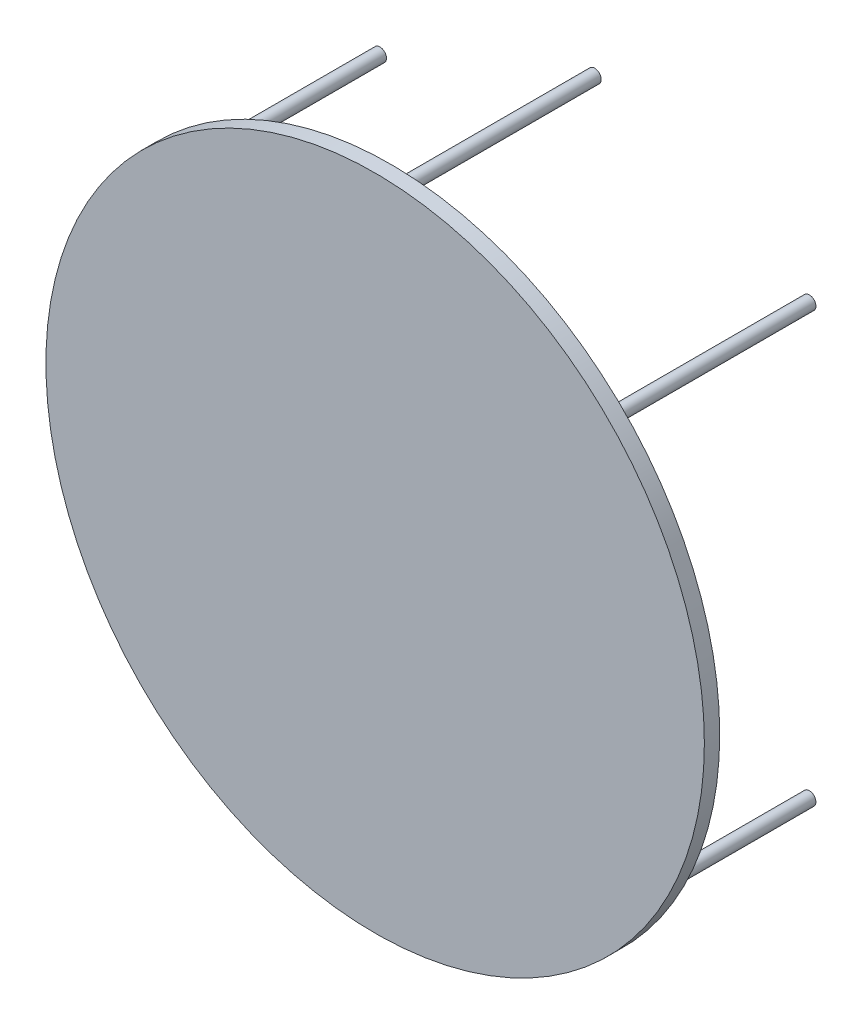
ISO-10303-21;
HEADER;
FILE_DESCRIPTION(('STEP AP214'),'2;1');
FILE_NAME('part.step','',(''),(''),'','','');
FILE_SCHEMA(('AUTOMOTIVE_DESIGN { 1 0 10303 214 1 1 1 1 }'));
ENDSEC;
DATA;
#1=APPLICATION_CONTEXT('core data for automotive mechanical design processes');
#2=APPLICATION_PROTOCOL_DEFINITION('international standard','automotive_design',2000,#1);
#3=PRODUCT_CONTEXT('',#1,'mechanical');
#4=PRODUCT('Part','Part','',(#3));
#5=PRODUCT_RELATED_PRODUCT_CATEGORY('part','',(#4));
#6=PRODUCT_DEFINITION_FORMATION('','',#4);
#7=PRODUCT_DEFINITION_CONTEXT('part definition',#1,'design');
#8=PRODUCT_DEFINITION('design','',#6,#7);
#9=PRODUCT_DEFINITION_SHAPE('','',#8);
#10=(LENGTH_UNIT() NAMED_UNIT(*) SI_UNIT(.MILLI.,.METRE.));
#11=(NAMED_UNIT(*) PLANE_ANGLE_UNIT() SI_UNIT($,.RADIAN.));
#12=(NAMED_UNIT(*) SI_UNIT($,.STERADIAN.) SOLID_ANGLE_UNIT());
#13=UNCERTAINTY_MEASURE_WITH_UNIT(LENGTH_MEASURE(1.E-05),#10,'distance_accuracy_value','');
#14=(GEOMETRIC_REPRESENTATION_CONTEXT(3) GLOBAL_UNCERTAINTY_ASSIGNED_CONTEXT((#13)) GLOBAL_UNIT_ASSIGNED_CONTEXT((#10,
#11,#12)) REPRESENTATION_CONTEXT('',''));
#15=CARTESIAN_POINT('',(0.,0.,0.));
#16=DIRECTION('',(0.,0.,1.));
#17=DIRECTION('',(1.,0.,0.));
#18=AXIS2_PLACEMENT_3D('',#15,#16,#17);
#19=CARTESIAN_POINT('',(0.,0.,5.334));
#20=DIRECTION('',(0.,0.,-1.));
#21=DIRECTION('',(-1.,0.,0.));
#22=AXIS2_PLACEMENT_3D('',#19,#20,#21);
#23=CYLINDRICAL_SURFACE('',#22,114.3);
#24=CARTESIAN_POINT('',(0.,0.,5.334));
#25=DIRECTION('',(0.,0.,1.));
#26=DIRECTION('',(1.,0.,0.));
#27=AXIS2_PLACEMENT_3D('',#24,#25,#26);
#28=CIRCLE('',#27,114.3);
#29=CARTESIAN_POINT('',(114.3,0.,5.334));
#30=VERTEX_POINT('',#29);
#31=EDGE_CURVE('E56',#30,#30,#28,.T.);
#32=ORIENTED_EDGE('',*,*,#31,.F.);
#33=EDGE_LOOP('',(#32));
#34=FACE_BOUND('',#33,.T.);
#35=CARTESIAN_POINT('',(0.,0.,0.));
#36=DIRECTION('',(0.,0.,1.));
#37=DIRECTION('',(1.,0.,0.));
#38=AXIS2_PLACEMENT_3D('',#35,#36,#37);
#39=CIRCLE('',#38,114.3);
#40=CARTESIAN_POINT('',(114.3,0.,0.));
#41=VERTEX_POINT('',#40);
#42=EDGE_CURVE('E57',#41,#41,#39,.T.);
#43=ORIENTED_EDGE('',*,*,#42,.T.);
#44=EDGE_LOOP('',(#43));
#45=FACE_BOUND('',#44,.T.);
#46=ADVANCED_FACE('F31',(#34,#45),#23,.T.);
#47=CARTESIAN_POINT('',(0.,0.,5.334));
#48=DIRECTION('',(0.,0.,1.));
#49=DIRECTION('',(1.,0.,0.));
#50=AXIS2_PLACEMENT_3D('',#47,#48,#49);
#51=PLANE('',#50);
#52=ORIENTED_EDGE('',*,*,#31,.T.);
#53=EDGE_LOOP('',(#52));
#54=FACE_BOUND('',#53,.T.);
#55=ADVANCED_FACE('F96',(#54),#51,.T.);
#56=CARTESIAN_POINT('',(0.,0.,0.));
#57=DIRECTION('',(0.,0.,1.));
#58=DIRECTION('',(1.,0.,0.));
#59=AXIS2_PLACEMENT_3D('',#56,#57,#58);
#60=PLANE('',#59);
#61=CARTESIAN_POINT('',(-74.536125804874,74.5361258048739,0.));
#62=DIRECTION('',(0.,0.,1.));
#63=DIRECTION('',(1.,0.,0.));
#64=AXIS2_PLACEMENT_3D('',#61,#62,#63);
#65=CIRCLE('',#64,2.28599999999999);
#66=CARTESIAN_POINT('',(-72.250125804874,74.5361258048739,0.));
#67=VERTEX_POINT('',#66);
#68=EDGE_CURVE('E10',#67,#67,#65,.F.);
#69=ORIENTED_EDGE('',*,*,#68,.F.);
#70=EDGE_LOOP('',(#69));
#71=FACE_BOUND('',#70,.T.);
#72=CARTESIAN_POINT('',(-74.5361258048739,-74.536125804874,0.));
#73=DIRECTION('',(0.,0.,1.));
#74=DIRECTION('',(1.,0.,0.));
#75=AXIS2_PLACEMENT_3D('',#72,#73,#74);
#76=CIRCLE('',#75,2.28599999999999);
#77=CARTESIAN_POINT('',(-72.250125804874,-74.536125804874,0.));
#78=VERTEX_POINT('',#77);
#79=EDGE_CURVE('E37',#78,#78,#76,.F.);
#80=ORIENTED_EDGE('',*,*,#79,.F.);
#81=EDGE_LOOP('',(#80));
#82=FACE_BOUND('',#81,.T.);
#83=CARTESIAN_POINT('',(0.,-105.41,0.));
#84=DIRECTION('',(0.,0.,1.));
#85=DIRECTION('',(1.,0.,0.));
#86=AXIS2_PLACEMENT_3D('',#83,#84,#85);
#87=CIRCLE('',#86,2.286);
#88=CARTESIAN_POINT('',(2.286,-105.41,0.));
#89=VERTEX_POINT('',#88);
#90=EDGE_CURVE('E41',#89,#89,#87,.F.);
#91=ORIENTED_EDGE('',*,*,#90,.F.);
#92=EDGE_LOOP('',(#91));
#93=FACE_BOUND('',#92,.T.);
#94=CARTESIAN_POINT('',(74.536125804874,-74.5361258048739,0.));
#95=DIRECTION('',(0.,0.,1.));
#96=DIRECTION('',(1.,0.,0.));
#97=AXIS2_PLACEMENT_3D('',#94,#95,#96);
#98=CIRCLE('',#97,2.28599999999999);
#99=CARTESIAN_POINT('',(76.822125804874,-74.5361258048739,0.));
#100=VERTEX_POINT('',#99);
#101=EDGE_CURVE('E45',#100,#100,#98,.F.);
#102=ORIENTED_EDGE('',*,*,#101,.F.);
#103=EDGE_LOOP('',(#102));
#104=FACE_BOUND('',#103,.T.);
#105=CARTESIAN_POINT('',(74.5361258048739,74.536125804874,0.));
#106=DIRECTION('',(0.,0.,1.));
#107=DIRECTION('',(1.,0.,0.));
#108=AXIS2_PLACEMENT_3D('',#105,#106,#107);
#109=CIRCLE('',#108,2.28599999999999);
#110=CARTESIAN_POINT('',(76.8221258048739,74.536125804874,0.));
#111=VERTEX_POINT('',#110);
#112=EDGE_CURVE('E50',#111,#111,#109,.F.);
#113=ORIENTED_EDGE('',*,*,#112,.F.);
#114=EDGE_LOOP('',(#113));
#115=FACE_BOUND('',#114,.T.);
#116=CARTESIAN_POINT('',(0.,105.41,0.));
#117=DIRECTION('',(0.,0.,1.));
#118=DIRECTION('',(1.,0.,0.));
#119=AXIS2_PLACEMENT_3D('',#116,#117,#118);
#120=CIRCLE('',#119,2.286);
#121=CARTESIAN_POINT('',(2.286,105.41,0.));
#122=VERTEX_POINT('',#121);
#123=EDGE_CURVE('E53',#122,#122,#120,.F.);
#124=ORIENTED_EDGE('',*,*,#123,.F.);
#125=EDGE_LOOP('',(#124));
#126=FACE_BOUND('',#125,.T.);
#127=ORIENTED_EDGE('',*,*,#42,.F.);
#128=EDGE_LOOP('',(#127));
#129=FACE_BOUND('',#128,.T.);
#130=ADVANCED_FACE('F101',(#71,#82,#93,#104,#115,#126,#129),#60,.F.);
#131=CARTESIAN_POINT('',(0.,105.41,-70.866));
#132=DIRECTION('',(0.,0.,1.));
#133=DIRECTION('',(1.,0.,0.));
#134=AXIS2_PLACEMENT_3D('',#131,#132,#133);
#135=CYLINDRICAL_SURFACE('',#134,2.286);
#136=CARTESIAN_POINT('',(0.,105.41,-70.866));
#137=DIRECTION('',(0.,0.,-1.));
#138=DIRECTION('',(-1.,0.,0.));
#139=AXIS2_PLACEMENT_3D('',#136,#137,#138);
#140=CIRCLE('',#139,2.286);
#141=CARTESIAN_POINT('',(-2.286,105.41,-70.866));
#142=VERTEX_POINT('',#141);
#143=EDGE_CURVE('E60',#142,#142,#140,.T.);
#144=ORIENTED_EDGE('',*,*,#143,.F.);
#145=EDGE_LOOP('',(#144));
#146=FACE_BOUND('',#145,.T.);
#147=ORIENTED_EDGE('',*,*,#123,.T.);
#148=EDGE_LOOP('',(#147));
#149=FACE_BOUND('',#148,.T.);
#150=ADVANCED_FACE('F109',(#146,#149),#135,.T.);
#151=CARTESIAN_POINT('',(0.,105.41,-70.866));
#152=DIRECTION('',(0.,0.,-1.));
#153=DIRECTION('',(-1.,0.,0.));
#154=AXIS2_PLACEMENT_3D('',#151,#152,#153);
#155=PLANE('',#154);
#156=ORIENTED_EDGE('',*,*,#143,.T.);
#157=EDGE_LOOP('',(#156));
#158=FACE_BOUND('',#157,.T.);
#159=ADVANCED_FACE('F114',(#158),#155,.T.);
#160=CARTESIAN_POINT('',(74.5361258048739,74.536125804874,-70.866));
#161=DIRECTION('',(0.,0.,1.));
#162=DIRECTION('',(1.,0.,0.));
#163=AXIS2_PLACEMENT_3D('',#160,#161,#162);
#164=CYLINDRICAL_SURFACE('',#163,2.28599999999999);
#165=CARTESIAN_POINT('',(74.5361258048739,74.536125804874,-70.866));
#166=DIRECTION('',(0.,0.,-1.));
#167=DIRECTION('',(-1.,0.,0.));
#168=AXIS2_PLACEMENT_3D('',#165,#166,#167);
#169=CIRCLE('',#168,2.28599999999999);
#170=CARTESIAN_POINT('',(72.250125804874,74.536125804874,-70.866));
#171=VERTEX_POINT('',#170);
#172=EDGE_CURVE('E65',#171,#171,#169,.T.);
#173=ORIENTED_EDGE('',*,*,#172,.F.);
#174=EDGE_LOOP('',(#173));
#175=FACE_BOUND('',#174,.T.);
#176=ORIENTED_EDGE('',*,*,#112,.T.);
#177=EDGE_LOOP('',(#176));
#178=FACE_BOUND('',#177,.T.);
#179=ADVANCED_FACE('F121',(#175,#178),#164,.T.);
#180=CARTESIAN_POINT('',(74.5361258048739,74.536125804874,-70.866));
#181=DIRECTION('',(0.,0.,-1.));
#182=DIRECTION('',(-1.,0.,0.));
#183=AXIS2_PLACEMENT_3D('',#180,#181,#182);
#184=PLANE('',#183);
#185=ORIENTED_EDGE('',*,*,#172,.T.);
#186=EDGE_LOOP('',(#185));
#187=FACE_BOUND('',#186,.T.);
#188=ADVANCED_FACE('F125',(#187),#184,.T.);
#189=CARTESIAN_POINT('',(74.536125804874,-74.5361258048739,-70.866));
#190=DIRECTION('',(0.,0.,1.));
#191=DIRECTION('',(1.,0.,0.));
#192=AXIS2_PLACEMENT_3D('',#189,#190,#191);
#193=CYLINDRICAL_SURFACE('',#192,2.28599999999999);
#194=CARTESIAN_POINT('',(74.536125804874,-74.5361258048739,-70.866));
#195=DIRECTION('',(0.,0.,-1.));
#196=DIRECTION('',(-1.,0.,0.));
#197=AXIS2_PLACEMENT_3D('',#194,#195,#196);
#198=CIRCLE('',#197,2.28599999999999);
#199=CARTESIAN_POINT('',(72.250125804874,-74.5361258048739,-70.866));
#200=VERTEX_POINT('',#199);
#201=EDGE_CURVE('E68',#200,#200,#198,.T.);
#202=ORIENTED_EDGE('',*,*,#201,.F.);
#203=EDGE_LOOP('',(#202));
#204=FACE_BOUND('',#203,.T.);
#205=ORIENTED_EDGE('',*,*,#101,.T.);
#206=EDGE_LOOP('',(#205));
#207=FACE_BOUND('',#206,.T.);
#208=ADVANCED_FACE('F129',(#204,#207),#193,.T.);
#209=CARTESIAN_POINT('',(74.536125804874,-74.5361258048739,-70.866));
#210=DIRECTION('',(0.,0.,-1.));
#211=DIRECTION('',(-1.,0.,0.));
#212=AXIS2_PLACEMENT_3D('',#209,#210,#211);
#213=PLANE('',#212);
#214=ORIENTED_EDGE('',*,*,#201,.T.);
#215=EDGE_LOOP('',(#214));
#216=FACE_BOUND('',#215,.T.);
#217=ADVANCED_FACE('F133',(#216),#213,.T.);
#218=CARTESIAN_POINT('',(0.,-105.41,-70.866));
#219=DIRECTION('',(0.,0.,1.));
#220=DIRECTION('',(1.,0.,0.));
#221=AXIS2_PLACEMENT_3D('',#218,#219,#220);
#222=CYLINDRICAL_SURFACE('',#221,2.286);
#223=CARTESIAN_POINT('',(0.,-105.41,-70.866));
#224=DIRECTION('',(0.,0.,-1.));
#225=DIRECTION('',(-1.,0.,0.));
#226=AXIS2_PLACEMENT_3D('',#223,#224,#225);
#227=CIRCLE('',#226,2.286);
#228=CARTESIAN_POINT('',(-2.286,-105.41,-70.866));
#229=VERTEX_POINT('',#228);
#230=EDGE_CURVE('E71',#229,#229,#227,.T.);
#231=ORIENTED_EDGE('',*,*,#230,.F.);
#232=EDGE_LOOP('',(#231));
#233=FACE_BOUND('',#232,.T.);
#234=ORIENTED_EDGE('',*,*,#90,.T.);
#235=EDGE_LOOP('',(#234));
#236=FACE_BOUND('',#235,.T.);
#237=ADVANCED_FACE('F137',(#233,#236),#222,.T.);
#238=CARTESIAN_POINT('',(0.,-105.41,-70.866));
#239=DIRECTION('',(0.,0.,-1.));
#240=DIRECTION('',(-1.,0.,0.));
#241=AXIS2_PLACEMENT_3D('',#238,#239,#240);
#242=PLANE('',#241);
#243=ORIENTED_EDGE('',*,*,#230,.T.);
#244=EDGE_LOOP('',(#243));
#245=FACE_BOUND('',#244,.T.);
#246=ADVANCED_FACE('F141',(#245),#242,.T.);
#247=CARTESIAN_POINT('',(-74.5361258048739,-74.536125804874,-70.866));
#248=DIRECTION('',(0.,0.,1.));
#249=DIRECTION('',(1.,0.,0.));
#250=AXIS2_PLACEMENT_3D('',#247,#248,#249);
#251=CYLINDRICAL_SURFACE('',#250,2.28599999999999);
#252=CARTESIAN_POINT('',(-74.5361258048739,-74.536125804874,-70.866));
#253=DIRECTION('',(0.,0.,-1.));
#254=DIRECTION('',(-1.,0.,0.));
#255=AXIS2_PLACEMENT_3D('',#252,#253,#254);
#256=CIRCLE('',#255,2.28599999999999);
#257=CARTESIAN_POINT('',(-76.8221258048739,-74.536125804874,-70.866));
#258=VERTEX_POINT('',#257);
#259=EDGE_CURVE('E74',#258,#258,#256,.T.);
#260=ORIENTED_EDGE('',*,*,#259,.F.);
#261=EDGE_LOOP('',(#260));
#262=FACE_BOUND('',#261,.T.);
#263=ORIENTED_EDGE('',*,*,#79,.T.);
#264=EDGE_LOOP('',(#263));
#265=FACE_BOUND('',#264,.T.);
#266=ADVANCED_FACE('F92',(#262,#265),#251,.T.);
#267=CARTESIAN_POINT('',(-74.5361258048739,-74.536125804874,-70.866));
#268=DIRECTION('',(0.,0.,-1.));
#269=DIRECTION('',(-1.,0.,0.));
#270=AXIS2_PLACEMENT_3D('',#267,#268,#269);
#271=PLANE('',#270);
#272=ORIENTED_EDGE('',*,*,#259,.T.);
#273=EDGE_LOOP('',(#272));
#274=FACE_BOUND('',#273,.T.);
#275=ADVANCED_FACE('F85',(#274),#271,.T.);
#276=CARTESIAN_POINT('',(-74.536125804874,74.5361258048739,-70.866));
#277=DIRECTION('',(0.,0.,1.));
#278=DIRECTION('',(1.,0.,0.));
#279=AXIS2_PLACEMENT_3D('',#276,#277,#278);
#280=CYLINDRICAL_SURFACE('',#279,2.28599999999999);
#281=CARTESIAN_POINT('',(-74.536125804874,74.5361258048739,-70.866));
#282=DIRECTION('',(0.,0.,-1.));
#283=DIRECTION('',(-1.,0.,0.));
#284=AXIS2_PLACEMENT_3D('',#281,#282,#283);
#285=CIRCLE('',#284,2.28599999999999);
#286=CARTESIAN_POINT('',(-76.822125804874,74.5361258048739,-70.866));
#287=VERTEX_POINT('',#286);
#288=EDGE_CURVE('E77',#287,#287,#285,.T.);
#289=ORIENTED_EDGE('',*,*,#288,.F.);
#290=EDGE_LOOP('',(#289));
#291=FACE_BOUND('',#290,.T.);
#292=ORIENTED_EDGE('',*,*,#68,.T.);
#293=EDGE_LOOP('',(#292));
#294=FACE_BOUND('',#293,.T.);
#295=ADVANCED_FACE('F83',(#291,#294),#280,.T.);
#296=CARTESIAN_POINT('',(-74.536125804874,74.5361258048739,-70.866));
#297=DIRECTION('',(0.,0.,-1.));
#298=DIRECTION('',(-1.,0.,0.));
#299=AXIS2_PLACEMENT_3D('',#296,#297,#298);
#300=PLANE('',#299);
#301=ORIENTED_EDGE('',*,*,#288,.T.);
#302=EDGE_LOOP('',(#301));
#303=FACE_BOUND('',#302,.T.);
#304=ADVANCED_FACE('F81',(#303),#300,.T.);
#305=CLOSED_SHELL('',(#46,#55,#130,#150,#159,#179,#188,#208,#217,#237,#246,#266,#275,#295,#304));
#306=MANIFOLD_SOLID_BREP('B2',#305);
#307=ADVANCED_BREP_SHAPE_REPRESENTATION('',(#18,#306),#14);
#308=SHAPE_DEFINITION_REPRESENTATION(#9,#307);
ENDSEC;
END-ISO-10303-21;
